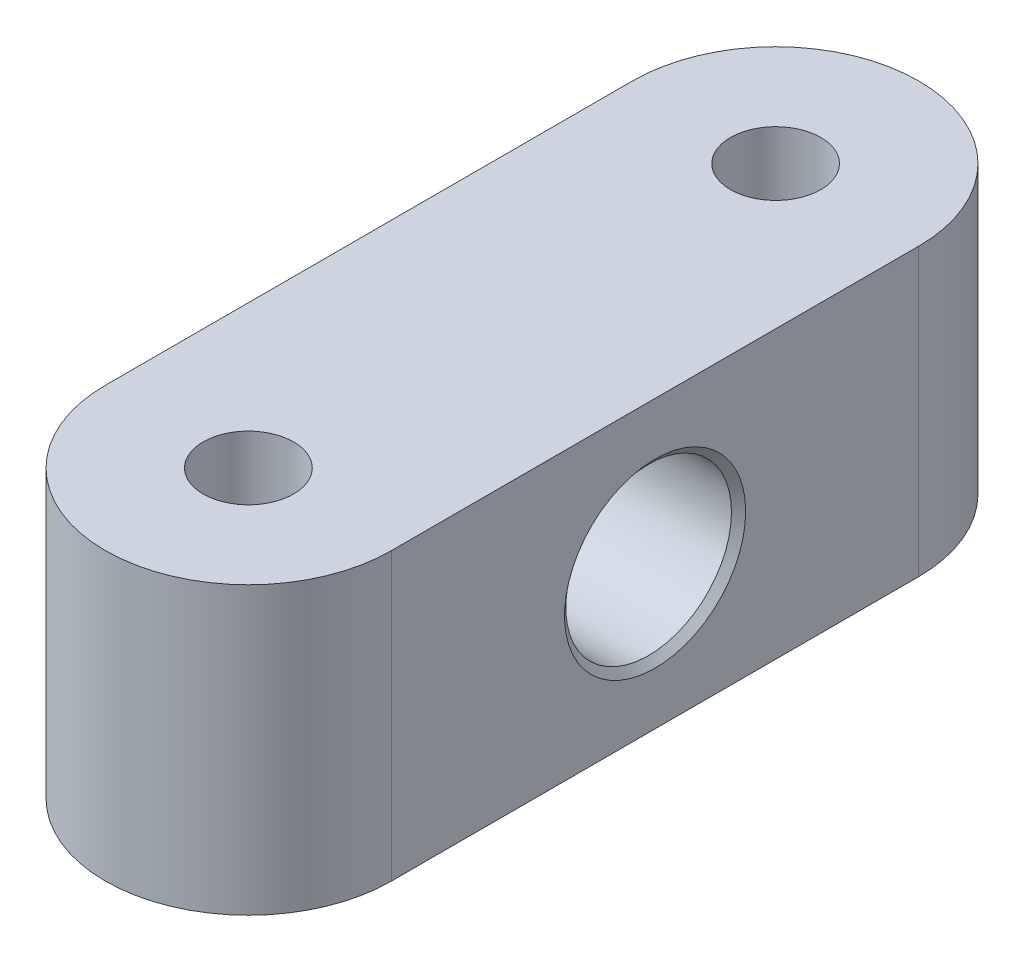
ISO-10303-21;
HEADER;
FILE_DESCRIPTION(('STEP AP214'),'2;1');
FILE_NAME('part.step','',(''),(''),'','','');
FILE_SCHEMA(('AUTOMOTIVE_DESIGN { 1 0 10303 214 1 1 1 1 }'));
ENDSEC;
DATA;
#1=APPLICATION_CONTEXT('core data for automotive mechanical design processes');
#2=APPLICATION_PROTOCOL_DEFINITION('international standard','automotive_design',2000,#1);
#3=PRODUCT_CONTEXT('',#1,'mechanical');
#4=PRODUCT('Part','Part','',(#3));
#5=PRODUCT_RELATED_PRODUCT_CATEGORY('part','',(#4));
#6=PRODUCT_DEFINITION_FORMATION('','',#4);
#7=PRODUCT_DEFINITION_CONTEXT('part definition',#1,'design');
#8=PRODUCT_DEFINITION('design','',#6,#7);
#9=PRODUCT_DEFINITION_SHAPE('','',#8);
#10=(LENGTH_UNIT() NAMED_UNIT(*) SI_UNIT(.MILLI.,.METRE.));
#11=(NAMED_UNIT(*) PLANE_ANGLE_UNIT() SI_UNIT($,.RADIAN.));
#12=(NAMED_UNIT(*) SI_UNIT($,.STERADIAN.) SOLID_ANGLE_UNIT());
#13=UNCERTAINTY_MEASURE_WITH_UNIT(LENGTH_MEASURE(1.E-05),#10,'distance_accuracy_value','');
#14=(GEOMETRIC_REPRESENTATION_CONTEXT(3) GLOBAL_UNCERTAINTY_ASSIGNED_CONTEXT((#13)) GLOBAL_UNIT_ASSIGNED_CONTEXT((#10,
#11,#12)) REPRESENTATION_CONTEXT('',''));
#15=CARTESIAN_POINT('',(0.,0.,0.));
#16=DIRECTION('',(0.,0.,1.));
#17=DIRECTION('',(1.,0.,0.));
#18=AXIS2_PLACEMENT_3D('',#15,#16,#17);
#19=CARTESIAN_POINT('',(19.,19.,0.));
#20=DIRECTION('',(-1.,0.,0.));
#21=DIRECTION('',(0.,0.,1.));
#22=AXIS2_PLACEMENT_3D('',#19,#20,#21);
#23=PLANE('',#22);
#24=DIRECTION('',(0.,0.,-1.));
#25=VECTOR('',#24,1.);
#26=CARTESIAN_POINT('',(19.,-19.,0.));
#27=LINE('',#26,#25);
#28=CARTESIAN_POINT('',(19.,-19.,0.));
#29=VERTEX_POINT('',#28);
#30=CARTESIAN_POINT('',(19.,-19.,-70.));
#31=VERTEX_POINT('',#30);
#32=EDGE_CURVE('E105',#29,#31,#27,.T.);
#33=ORIENTED_EDGE('',*,*,#32,.T.);
#34=DIRECTION('',(0.,-1.,0.));
#35=VECTOR('',#34,1.);
#36=CARTESIAN_POINT('',(19.,19.,-70.));
#37=LINE('',#36,#35);
#38=CARTESIAN_POINT('',(19.,19.,-70.));
#39=VERTEX_POINT('',#38);
#40=EDGE_CURVE('E53',#39,#31,#37,.T.);
#41=ORIENTED_EDGE('',*,*,#40,.F.);
#42=DIRECTION('',(0.,0.,-1.));
#43=VECTOR('',#42,1.);
#44=CARTESIAN_POINT('',(19.,19.,0.));
#45=LINE('',#44,#43);
#46=CARTESIAN_POINT('',(19.,19.,0.));
#47=VERTEX_POINT('',#46);
#48=EDGE_CURVE('E95',#47,#39,#45,.T.);
#49=ORIENTED_EDGE('',*,*,#48,.F.);
#50=DIRECTION('',(0.,-1.,0.));
#51=VECTOR('',#50,1.);
#52=CARTESIAN_POINT('',(19.,19.,0.));
#53=LINE('',#52,#51);
#54=EDGE_CURVE('E11',#47,#29,#53,.T.);
#55=ORIENTED_EDGE('',*,*,#54,.T.);
#56=EDGE_LOOP('',(#33,#41,#49,#55));
#57=FACE_BOUND('',#56,.T.);
#58=CARTESIAN_POINT('',(19.,0.,-35.));
#59=DIRECTION('',(1.,0.,0.));
#60=DIRECTION('',(0.,0.,-1.));
#61=AXIS2_PLACEMENT_3D('',#58,#59,#60);
#62=CIRCLE('',#61,12.025);
#63=CARTESIAN_POINT('',(19.,0.,-47.025));
#64=VERTEX_POINT('',#63);
#65=EDGE_CURVE('E145',#64,#64,#62,.T.);
#66=ORIENTED_EDGE('',*,*,#65,.F.);
#67=EDGE_LOOP('',(#66));
#68=FACE_BOUND('',#67,.T.);
#69=ADVANCED_FACE('F44',(#57,#68),#23,.F.);
#70=CARTESIAN_POINT('',(0.,19.,0.));
#71=DIRECTION('',(0.,1.,0.));
#72=DIRECTION('',(0.,0.,1.));
#73=AXIS2_PLACEMENT_3D('',#70,#71,#72);
#74=PLANE('',#73);
#75=CARTESIAN_POINT('',(0.,19.,-70.));
#76=DIRECTION('',(0.,1.,0.));
#77=DIRECTION('',(0.,0.,1.));
#78=AXIS2_PLACEMENT_3D('',#75,#76,#77);
#79=CIRCLE('',#78,6.);
#80=CARTESIAN_POINT('',(0.,19.,-64.));
#81=VERTEX_POINT('',#80);
#82=EDGE_CURVE('E111',#81,#81,#79,.T.);
#83=ORIENTED_EDGE('',*,*,#82,.F.);
#84=EDGE_LOOP('',(#83));
#85=FACE_BOUND('',#84,.T.);
#86=CARTESIAN_POINT('',(0.,19.,0.));
#87=DIRECTION('',(0.,1.,0.));
#88=DIRECTION('',(0.,0.,1.));
#89=AXIS2_PLACEMENT_3D('',#86,#87,#88);
#90=CIRCLE('',#89,19.);
#91=CARTESIAN_POINT('',(-19.,19.,0.));
#92=VERTEX_POINT('',#91);
#93=EDGE_CURVE('E97',#92,#47,#90,.T.);
#94=ORIENTED_EDGE('',*,*,#93,.T.);
#95=ORIENTED_EDGE('',*,*,#48,.T.);
#96=CARTESIAN_POINT('',(0.,19.,-70.));
#97=DIRECTION('',(0.,1.,0.));
#98=DIRECTION('',(0.,0.,1.));
#99=AXIS2_PLACEMENT_3D('',#96,#97,#98);
#100=CIRCLE('',#99,19.);
#101=CARTESIAN_POINT('',(-19.,19.,-70.));
#102=VERTEX_POINT('',#101);
#103=EDGE_CURVE('E96',#39,#102,#100,.T.);
#104=ORIENTED_EDGE('',*,*,#103,.T.);
#105=DIRECTION('',(0.,0.,1.));
#106=VECTOR('',#105,1.);
#107=CARTESIAN_POINT('',(-19.,19.,0.));
#108=LINE('',#107,#106);
#109=EDGE_CURVE('E65',#102,#92,#108,.T.);
#110=ORIENTED_EDGE('',*,*,#109,.T.);
#111=EDGE_LOOP('',(#94,#95,#104,#110));
#112=FACE_BOUND('',#111,.T.);
#113=CARTESIAN_POINT('',(0.,19.,0.));
#114=DIRECTION('',(0.,1.,0.));
#115=DIRECTION('',(0.,0.,1.));
#116=AXIS2_PLACEMENT_3D('',#113,#114,#115);
#117=CIRCLE('',#116,6.);
#118=CARTESIAN_POINT('',(0.,19.,6.));
#119=VERTEX_POINT('',#118);
#120=EDGE_CURVE('E126',#119,#119,#117,.T.);
#121=ORIENTED_EDGE('',*,*,#120,.F.);
#122=EDGE_LOOP('',(#121));
#123=FACE_BOUND('',#122,.T.);
#124=ADVANCED_FACE('F93',(#85,#112,#123),#74,.T.);
#125=CARTESIAN_POINT('',(0.,-19.,0.));
#126=DIRECTION('',(0.,1.,0.));
#127=DIRECTION('',(0.,0.,1.));
#128=AXIS2_PLACEMENT_3D('',#125,#126,#127);
#129=PLANE('',#128);
#130=CARTESIAN_POINT('',(0.,-19.,0.));
#131=DIRECTION('',(0.,1.,0.));
#132=DIRECTION('',(0.,0.,1.));
#133=AXIS2_PLACEMENT_3D('',#130,#131,#132);
#134=CIRCLE('',#133,19.);
#135=CARTESIAN_POINT('',(-19.,-19.,0.));
#136=VERTEX_POINT('',#135);
#137=EDGE_CURVE('E109',#136,#29,#134,.T.);
#138=ORIENTED_EDGE('',*,*,#137,.F.);
#139=DIRECTION('',(0.,0.,1.));
#140=VECTOR('',#139,1.);
#141=CARTESIAN_POINT('',(-19.,-19.,0.));
#142=LINE('',#141,#140);
#143=CARTESIAN_POINT('',(-19.,-19.,-70.));
#144=VERTEX_POINT('',#143);
#145=EDGE_CURVE('E82',#144,#136,#142,.T.);
#146=ORIENTED_EDGE('',*,*,#145,.F.);
#147=CARTESIAN_POINT('',(0.,-19.,-70.));
#148=DIRECTION('',(0.,1.,0.));
#149=DIRECTION('',(0.,0.,1.));
#150=AXIS2_PLACEMENT_3D('',#147,#148,#149);
#151=CIRCLE('',#150,19.);
#152=EDGE_CURVE('E80',#31,#144,#151,.T.);
#153=ORIENTED_EDGE('',*,*,#152,.F.);
#154=ORIENTED_EDGE('',*,*,#32,.F.);
#155=EDGE_LOOP('',(#138,#146,#153,#154));
#156=FACE_BOUND('',#155,.T.);
#157=CARTESIAN_POINT('',(0.,-19.,-70.));
#158=DIRECTION('',(0.,1.,0.));
#159=DIRECTION('',(0.,0.,1.));
#160=AXIS2_PLACEMENT_3D('',#157,#158,#159);
#161=CIRCLE('',#160,6.);
#162=CARTESIAN_POINT('',(0.,-19.,-64.));
#163=VERTEX_POINT('',#162);
#164=EDGE_CURVE('E124',#163,#163,#161,.T.);
#165=ORIENTED_EDGE('',*,*,#164,.T.);
#166=EDGE_LOOP('',(#165));
#167=FACE_BOUND('',#166,.T.);
#168=CARTESIAN_POINT('',(0.,-19.,0.));
#169=DIRECTION('',(0.,1.,0.));
#170=DIRECTION('',(0.,0.,1.));
#171=AXIS2_PLACEMENT_3D('',#168,#169,#170);
#172=CIRCLE('',#171,6.);
#173=CARTESIAN_POINT('',(0.,-19.,6.));
#174=VERTEX_POINT('',#173);
#175=EDGE_CURVE('E131',#174,#174,#172,.T.);
#176=ORIENTED_EDGE('',*,*,#175,.T.);
#177=EDGE_LOOP('',(#176));
#178=FACE_BOUND('',#177,.T.);
#179=ADVANCED_FACE('F123',(#156,#167,#178),#129,.F.);
#180=CARTESIAN_POINT('',(0.,19.,0.));
#181=DIRECTION('',(0.,-1.,0.));
#182=DIRECTION('',(0.,0.,-1.));
#183=AXIS2_PLACEMENT_3D('',#180,#181,#182);
#184=CYLINDRICAL_SURFACE('',#183,19.);
#185=ORIENTED_EDGE('',*,*,#137,.T.);
#186=ORIENTED_EDGE('',*,*,#54,.F.);
#187=ORIENTED_EDGE('',*,*,#93,.F.);
#188=DIRECTION('',(0.,-1.,0.));
#189=VECTOR('',#188,1.);
#190=CARTESIAN_POINT('',(-19.,19.,0.));
#191=LINE('',#190,#189);
#192=EDGE_CURVE('E108',#92,#136,#191,.T.);
#193=ORIENTED_EDGE('',*,*,#192,.T.);
#194=EDGE_LOOP('',(#185,#186,#187,#193));
#195=FACE_BOUND('',#194,.T.);
#196=ADVANCED_FACE('F50',(#195),#184,.T.);
#197=CARTESIAN_POINT('',(0.,19.,-70.));
#198=DIRECTION('',(0.,-1.,0.));
#199=DIRECTION('',(0.,0.,-1.));
#200=AXIS2_PLACEMENT_3D('',#197,#198,#199);
#201=CYLINDRICAL_SURFACE('',#200,19.);
#202=ORIENTED_EDGE('',*,*,#152,.T.);
#203=DIRECTION('',(0.,-1.,0.));
#204=VECTOR('',#203,1.);
#205=CARTESIAN_POINT('',(-19.,19.,-70.));
#206=LINE('',#205,#204);
#207=EDGE_CURVE('E104',#102,#144,#206,.T.);
#208=ORIENTED_EDGE('',*,*,#207,.F.);
#209=ORIENTED_EDGE('',*,*,#103,.F.);
#210=ORIENTED_EDGE('',*,*,#40,.T.);
#211=EDGE_LOOP('',(#202,#208,#209,#210));
#212=FACE_BOUND('',#211,.T.);
#213=ADVANCED_FACE('F101',(#212),#201,.T.);
#214=CARTESIAN_POINT('',(-19.,19.,0.));
#215=DIRECTION('',(1.,0.,0.));
#216=DIRECTION('',(0.,0.,-1.));
#217=AXIS2_PLACEMENT_3D('',#214,#215,#216);
#218=PLANE('',#217);
#219=CARTESIAN_POINT('',(-19.,0.,-35.));
#220=DIRECTION('',(1.,0.,0.));
#221=DIRECTION('',(0.,0.,-1.));
#222=AXIS2_PLACEMENT_3D('',#219,#220,#221);
#223=CIRCLE('',#222,11.);
#224=CARTESIAN_POINT('',(-19.,0.,-46.));
#225=VERTEX_POINT('',#224);
#226=EDGE_CURVE('E132',#225,#225,#223,.T.);
#227=ORIENTED_EDGE('',*,*,#226,.T.);
#228=EDGE_LOOP('',(#227));
#229=FACE_BOUND('',#228,.T.);
#230=ORIENTED_EDGE('',*,*,#145,.T.);
#231=ORIENTED_EDGE('',*,*,#192,.F.);
#232=ORIENTED_EDGE('',*,*,#109,.F.);
#233=ORIENTED_EDGE('',*,*,#207,.T.);
#234=EDGE_LOOP('',(#230,#231,#232,#233));
#235=FACE_BOUND('',#234,.T.);
#236=ADVANCED_FACE('F116',(#229,#235),#218,.F.);
#237=CARTESIAN_POINT('',(0.,19.,-70.));
#238=DIRECTION('',(0.,-1.,0.));
#239=DIRECTION('',(0.,0.,-1.));
#240=AXIS2_PLACEMENT_3D('',#237,#238,#239);
#241=CYLINDRICAL_SURFACE('',#240,6.);
#242=ORIENTED_EDGE('',*,*,#82,.T.);
#243=EDGE_LOOP('',(#242));
#244=FACE_BOUND('',#243,.T.);
#245=ORIENTED_EDGE('',*,*,#164,.F.);
#246=EDGE_LOOP('',(#245));
#247=FACE_BOUND('',#246,.T.);
#248=ADVANCED_FACE('F159',(#244,#247),#241,.F.);
#249=CARTESIAN_POINT('',(0.,19.,0.));
#250=DIRECTION('',(0.,-1.,0.));
#251=DIRECTION('',(0.,0.,-1.));
#252=AXIS2_PLACEMENT_3D('',#249,#250,#251);
#253=CYLINDRICAL_SURFACE('',#252,6.);
#254=ORIENTED_EDGE('',*,*,#120,.T.);
#255=EDGE_LOOP('',(#254));
#256=FACE_BOUND('',#255,.T.);
#257=ORIENTED_EDGE('',*,*,#175,.F.);
#258=EDGE_LOOP('',(#257));
#259=FACE_BOUND('',#258,.T.);
#260=ADVANCED_FACE('F164',(#256,#259),#253,.F.);
#261=CARTESIAN_POINT('',(19.,0.,-35.));
#262=DIRECTION('',(1.,0.,0.));
#263=DIRECTION('',(0.,0.,-1.));
#264=AXIS2_PLACEMENT_3D('',#261,#262,#263);
#265=CYLINDRICAL_SURFACE('',#264,11.);
#266=ORIENTED_EDGE('',*,*,#226,.F.);
#267=EDGE_LOOP('',(#266));
#268=FACE_BOUND('',#267,.T.);
#269=CARTESIAN_POINT('',(18.1399228780433,0.,-35.));
#270=DIRECTION('',(1.,0.,0.));
#271=DIRECTION('',(0.,0.,-1.));
#272=AXIS2_PLACEMENT_3D('',#269,#270,#271);
#273=CIRCLE('',#272,11.);
#274=CARTESIAN_POINT('',(18.1399228780433,0.,-46.));
#275=VERTEX_POINT('',#274);
#276=EDGE_CURVE('E137',#275,#275,#273,.T.);
#277=ORIENTED_EDGE('',*,*,#276,.T.);
#278=EDGE_LOOP('',(#277));
#279=FACE_BOUND('',#278,.T.);
#280=ADVANCED_FACE('F170',(#268,#279),#265,.F.);
#281=CARTESIAN_POINT('',(19.,0.,-35.));
#282=DIRECTION('',(1.,0.,0.));
#283=DIRECTION('',(0.,0.,-1.));
#284=AXIS2_PLACEMENT_3D('',#281,#282,#283);
#285=CONICAL_SURFACE('',#284,12.025,0.872664625997168);
#286=ORIENTED_EDGE('',*,*,#276,.F.);
#287=EDGE_LOOP('',(#286));
#288=FACE_BOUND('',#287,.T.);
#289=ORIENTED_EDGE('',*,*,#65,.T.);
#290=EDGE_LOOP('',(#289));
#291=FACE_BOUND('',#290,.T.);
#292=ADVANCED_FACE('F147',(#288,#291),#285,.F.);
#293=CLOSED_SHELL('',(#69,#124,#179,#196,#213,#236,#248,#260,#280,#292));
#294=MANIFOLD_SOLID_BREP('B2',#293);
#295=ADVANCED_BREP_SHAPE_REPRESENTATION('',(#18,#294),#14);
#296=SHAPE_DEFINITION_REPRESENTATION(#9,#295);
ENDSEC;
END-ISO-10303-21;
